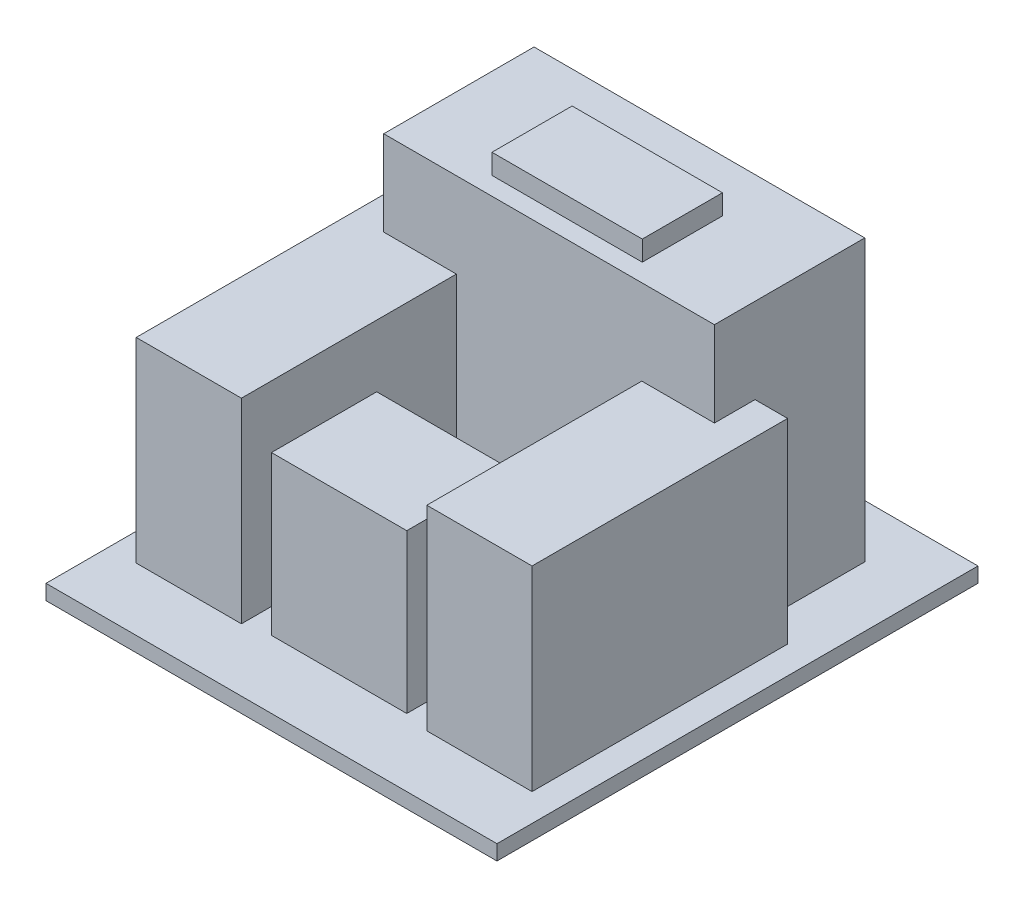
ISO-10303-21;
HEADER;
FILE_DESCRIPTION(('STEP AP214'),'2;1');
FILE_NAME('part.step','',(''),(''),'','','');
FILE_SCHEMA(('AUTOMOTIVE_DESIGN { 1 0 10303 214 1 1 1 1 }'));
ENDSEC;
DATA;
#1=APPLICATION_CONTEXT('core data for automotive mechanical design processes');
#2=APPLICATION_PROTOCOL_DEFINITION('international standard','automotive_design',2000,#1);
#3=PRODUCT_CONTEXT('',#1,'mechanical');
#4=PRODUCT('Part','Part','',(#3));
#5=PRODUCT_RELATED_PRODUCT_CATEGORY('part','',(#4));
#6=PRODUCT_DEFINITION_FORMATION('','',#4);
#7=PRODUCT_DEFINITION_CONTEXT('part definition',#1,'design');
#8=PRODUCT_DEFINITION('design','',#6,#7);
#9=PRODUCT_DEFINITION_SHAPE('','',#8);
#10=(LENGTH_UNIT() NAMED_UNIT(*) SI_UNIT(.MILLI.,.METRE.));
#11=(NAMED_UNIT(*) PLANE_ANGLE_UNIT() SI_UNIT($,.RADIAN.));
#12=(NAMED_UNIT(*) SI_UNIT($,.STERADIAN.) SOLID_ANGLE_UNIT());
#13=UNCERTAINTY_MEASURE_WITH_UNIT(LENGTH_MEASURE(1.E-05),#10,'distance_accuracy_value','');
#14=(GEOMETRIC_REPRESENTATION_CONTEXT(3) GLOBAL_UNCERTAINTY_ASSIGNED_CONTEXT((#13)) GLOBAL_UNIT_ASSIGNED_CONTEXT((#10,
#11,#12)) REPRESENTATION_CONTEXT('',''));
#15=CARTESIAN_POINT('',(0.,0.,0.));
#16=DIRECTION('',(0.,0.,1.));
#17=DIRECTION('',(1.,0.,0.));
#18=AXIS2_PLACEMENT_3D('',#15,#16,#17);
#19=CARTESIAN_POINT('',(0.,280.,0.));
#20=DIRECTION('',(0.,-1.,0.));
#21=DIRECTION('',(0.,0.,-1.));
#22=AXIS2_PLACEMENT_3D('',#19,#20,#21);
#23=PLANE('',#22);
#24=DIRECTION('',(0.,0.,-1.));
#25=VECTOR('',#24,1.);
#26=CARTESIAN_POINT('',(165.,280.,-37.));
#27=LINE('',#26,#25);
#28=CARTESIAN_POINT('',(165.,280.,-37.));
#29=VERTEX_POINT('',#28);
#30=CARTESIAN_POINT('',(165.,280.,-187.));
#31=VERTEX_POINT('',#30);
#32=EDGE_CURVE('E337',#29,#31,#27,.T.);
#33=ORIENTED_EDGE('',*,*,#32,.T.);
#34=DIRECTION('',(-1.,0.,0.));
#35=VECTOR('',#34,1.);
#36=CARTESIAN_POINT('',(-165.,280.,-187.));
#37=LINE('',#36,#35);
#38=CARTESIAN_POINT('',(-165.,280.,-187.));
#39=VERTEX_POINT('',#38);
#40=EDGE_CURVE('E340',#31,#39,#37,.T.);
#41=ORIENTED_EDGE('',*,*,#40,.T.);
#42=DIRECTION('',(0.,0.,1.));
#43=VECTOR('',#42,1.);
#44=CARTESIAN_POINT('',(-165.,280.,-37.));
#45=LINE('',#44,#43);
#46=CARTESIAN_POINT('',(-165.,280.,-37.));
#47=VERTEX_POINT('',#46);
#48=EDGE_CURVE('E343',#39,#47,#45,.T.);
#49=ORIENTED_EDGE('',*,*,#48,.T.);
#50=DIRECTION('',(1.,0.,0.));
#51=VECTOR('',#50,1.);
#52=CARTESIAN_POINT('',(-165.,280.,-37.));
#53=LINE('',#52,#51);
#54=EDGE_CURVE('E345',#47,#29,#53,.T.);
#55=ORIENTED_EDGE('',*,*,#54,.T.);
#56=EDGE_LOOP('',(#33,#41,#49,#55));
#57=FACE_BOUND('',#56,.T.);
#58=DIRECTION('',(0.,0.,-1.));
#59=VECTOR('',#58,1.);
#60=CARTESIAN_POINT('',(75.,280.,0.));
#61=LINE('',#60,#59);
#62=CARTESIAN_POINT('',(75.,280.,-55.));
#63=VERTEX_POINT('',#62);
#64=CARTESIAN_POINT('',(75.,280.,-135.));
#65=VERTEX_POINT('',#64);
#66=EDGE_CURVE('E11',#63,#65,#61,.T.);
#67=ORIENTED_EDGE('',*,*,#66,.F.);
#68=DIRECTION('',(1.,0.,0.));
#69=VECTOR('',#68,1.);
#70=CARTESIAN_POINT('',(0.,280.,-55.));
#71=LINE('',#70,#69);
#72=CARTESIAN_POINT('',(-75.,280.,-55.));
#73=VERTEX_POINT('',#72);
#74=EDGE_CURVE('E416',#73,#63,#71,.T.);
#75=ORIENTED_EDGE('',*,*,#74,.F.);
#76=DIRECTION('',(0.,0.,1.));
#77=VECTOR('',#76,1.);
#78=CARTESIAN_POINT('',(-75.,280.,0.));
#79=LINE('',#78,#77);
#80=CARTESIAN_POINT('',(-75.,280.,-135.));
#81=VERTEX_POINT('',#80);
#82=EDGE_CURVE('E59',#81,#73,#79,.T.);
#83=ORIENTED_EDGE('',*,*,#82,.F.);
#84=DIRECTION('',(-1.,0.,0.));
#85=VECTOR('',#84,1.);
#86=CARTESIAN_POINT('',(0.,280.,-135.));
#87=LINE('',#86,#85);
#88=EDGE_CURVE('E49',#65,#81,#87,.T.);
#89=ORIENTED_EDGE('',*,*,#88,.F.);
#90=EDGE_LOOP('',(#67,#75,#83,#89));
#91=FACE_BOUND('',#90,.T.);
#92=ADVANCED_FACE('F41',(#57,#91),#23,.F.);
#93=CARTESIAN_POINT('',(0.,0.,0.));
#94=DIRECTION('',(0.,-1.,0.));
#95=DIRECTION('',(0.,0.,-1.));
#96=AXIS2_PLACEMENT_3D('',#93,#94,#95);
#97=PLANE('',#96);
#98=DIRECTION('',(-1.,0.,0.));
#99=VECTOR('',#98,1.);
#100=CARTESIAN_POINT('',(92.5,0.,-77.5));
#101=LINE('',#100,#99);
#102=CARTESIAN_POINT('',(197.5,0.,-77.5));
#103=VERTEX_POINT('',#102);
#104=CARTESIAN_POINT('',(165.,0.,-77.5));
#105=VERTEX_POINT('',#104);
#106=EDGE_CURVE('E284',#103,#105,#101,.T.);
#107=ORIENTED_EDGE('',*,*,#106,.F.);
#108=DIRECTION('',(0.,0.,-1.));
#109=VECTOR('',#108,1.);
#110=CARTESIAN_POINT('',(197.5,0.,177.5));
#111=LINE('',#110,#109);
#112=CARTESIAN_POINT('',(197.5,0.,177.5));
#113=VERTEX_POINT('',#112);
#114=EDGE_CURVE('E269',#113,#103,#111,.T.);
#115=ORIENTED_EDGE('',*,*,#114,.F.);
#116=DIRECTION('',(1.,0.,0.));
#117=VECTOR('',#116,1.);
#118=CARTESIAN_POINT('',(92.5,0.,177.5));
#119=LINE('',#118,#117);
#120=CARTESIAN_POINT('',(92.5,0.,177.5));
#121=VERTEX_POINT('',#120);
#122=EDGE_CURVE('E274',#121,#113,#119,.T.);
#123=ORIENTED_EDGE('',*,*,#122,.F.);
#124=DIRECTION('',(0.,0.,1.));
#125=VECTOR('',#124,1.);
#126=CARTESIAN_POINT('',(92.5,0.,177.5));
#127=LINE('',#126,#125);
#128=CARTESIAN_POINT('',(92.5,0.,-37.));
#129=VERTEX_POINT('',#128);
#130=EDGE_CURVE('E287',#129,#121,#127,.T.);
#131=ORIENTED_EDGE('',*,*,#130,.F.);
#132=DIRECTION('',(1.,0.,0.));
#133=VECTOR('',#132,1.);
#134=CARTESIAN_POINT('',(-165.,0.,-37.));
#135=LINE('',#134,#133);
#136=CARTESIAN_POINT('',(-92.5,0.,-37.));
#137=VERTEX_POINT('',#136);
#138=EDGE_CURVE('E341',#137,#129,#135,.T.);
#139=ORIENTED_EDGE('',*,*,#138,.F.);
#140=DIRECTION('',(0.,0.,-1.));
#141=VECTOR('',#140,1.);
#142=CARTESIAN_POINT('',(-92.5,0.,177.5));
#143=LINE('',#142,#141);
#144=CARTESIAN_POINT('',(-92.5,0.,177.5));
#145=VERTEX_POINT('',#144);
#146=EDGE_CURVE('E303',#145,#137,#143,.T.);
#147=ORIENTED_EDGE('',*,*,#146,.F.);
#148=DIRECTION('',(1.,0.,0.));
#149=VECTOR('',#148,1.);
#150=CARTESIAN_POINT('',(-197.5,0.,177.5));
#151=LINE('',#150,#149);
#152=CARTESIAN_POINT('',(-197.5,0.,177.5));
#153=VERTEX_POINT('',#152);
#154=EDGE_CURVE('E308',#153,#145,#151,.T.);
#155=ORIENTED_EDGE('',*,*,#154,.F.);
#156=DIRECTION('',(0.,0.,1.));
#157=VECTOR('',#156,1.);
#158=CARTESIAN_POINT('',(-197.5,0.,177.5));
#159=LINE('',#158,#157);
#160=CARTESIAN_POINT('',(-197.5,0.,-77.5));
#161=VERTEX_POINT('',#160);
#162=EDGE_CURVE('E320',#161,#153,#159,.T.);
#163=ORIENTED_EDGE('',*,*,#162,.F.);
#164=DIRECTION('',(-1.,0.,0.));
#165=VECTOR('',#164,1.);
#166=CARTESIAN_POINT('',(-197.5,0.,-77.5));
#167=LINE('',#166,#165);
#168=CARTESIAN_POINT('',(-165.,0.,-77.5));
#169=VERTEX_POINT('',#168);
#170=EDGE_CURVE('E317',#169,#161,#167,.T.);
#171=ORIENTED_EDGE('',*,*,#170,.F.);
#172=DIRECTION('',(0.,0.,1.));
#173=VECTOR('',#172,1.);
#174=CARTESIAN_POINT('',(-165.,0.,-37.));
#175=LINE('',#174,#173);
#176=CARTESIAN_POINT('',(-165.,0.,-187.));
#177=VERTEX_POINT('',#176);
#178=EDGE_CURVE('E352',#177,#169,#175,.T.);
#179=ORIENTED_EDGE('',*,*,#178,.F.);
#180=DIRECTION('',(-1.,0.,0.));
#181=VECTOR('',#180,1.);
#182=CARTESIAN_POINT('',(-165.,0.,-187.));
#183=LINE('',#182,#181);
#184=CARTESIAN_POINT('',(165.,0.,-187.));
#185=VERTEX_POINT('',#184);
#186=EDGE_CURVE('E349',#185,#177,#183,.T.);
#187=ORIENTED_EDGE('',*,*,#186,.F.);
#188=DIRECTION('',(0.,0.,-1.));
#189=VECTOR('',#188,1.);
#190=CARTESIAN_POINT('',(165.,0.,-37.));
#191=LINE('',#190,#189);
#192=EDGE_CURVE('E336',#105,#185,#191,.T.);
#193=ORIENTED_EDGE('',*,*,#192,.F.);
#194=EDGE_LOOP('',(#107,#115,#123,#131,#139,#147,#155,#163,#171,#179,#187,#193));
#195=FACE_BOUND('',#194,.T.);
#196=DIRECTION('',(0.,0.,-1.));
#197=VECTOR('',#196,1.);
#198=CARTESIAN_POINT('',(225.,0.,240.));
#199=LINE('',#198,#197);
#200=CARTESIAN_POINT('',(225.,0.,240.));
#201=VERTEX_POINT('',#200);
#202=CARTESIAN_POINT('',(225.,0.,-240.));
#203=VERTEX_POINT('',#202);
#204=EDGE_CURVE('E366',#201,#203,#199,.T.);
#205=ORIENTED_EDGE('',*,*,#204,.T.);
#206=DIRECTION('',(-1.,0.,0.));
#207=VECTOR('',#206,1.);
#208=CARTESIAN_POINT('',(-225.,0.,-240.));
#209=LINE('',#208,#207);
#210=CARTESIAN_POINT('',(-225.,0.,-240.));
#211=VERTEX_POINT('',#210);
#212=EDGE_CURVE('E383',#203,#211,#209,.T.);
#213=ORIENTED_EDGE('',*,*,#212,.T.);
#214=DIRECTION('',(0.,0.,1.));
#215=VECTOR('',#214,1.);
#216=CARTESIAN_POINT('',(-225.,0.,240.));
#217=LINE('',#216,#215);
#218=CARTESIAN_POINT('',(-225.,0.,240.));
#219=VERTEX_POINT('',#218);
#220=EDGE_CURVE('E386',#211,#219,#217,.T.);
#221=ORIENTED_EDGE('',*,*,#220,.T.);
#222=DIRECTION('',(1.,0.,0.));
#223=VECTOR('',#222,1.);
#224=CARTESIAN_POINT('',(-225.,0.,240.));
#225=LINE('',#224,#223);
#226=EDGE_CURVE('E371',#219,#201,#225,.T.);
#227=ORIENTED_EDGE('',*,*,#226,.T.);
#228=EDGE_LOOP('',(#205,#213,#221,#227));
#229=FACE_BOUND('',#228,.T.);
#230=DIRECTION('',(0.,0.,-1.));
#231=VECTOR('',#230,1.);
#232=CARTESIAN_POINT('',(67.5,0.,172.5));
#233=LINE('',#232,#231);
#234=CARTESIAN_POINT('',(67.5,0.,172.5));
#235=VERTEX_POINT('',#234);
#236=CARTESIAN_POINT('',(67.5,0.,67.5));
#237=VERTEX_POINT('',#236);
#238=EDGE_CURVE('E231',#235,#237,#233,.T.);
#239=ORIENTED_EDGE('',*,*,#238,.F.);
#240=DIRECTION('',(1.,0.,0.));
#241=VECTOR('',#240,1.);
#242=CARTESIAN_POINT('',(-67.5,0.,172.5));
#243=LINE('',#242,#241);
#244=CARTESIAN_POINT('',(-67.5,0.,172.5));
#245=VERTEX_POINT('',#244);
#246=EDGE_CURVE('E244',#245,#235,#243,.T.);
#247=ORIENTED_EDGE('',*,*,#246,.F.);
#248=DIRECTION('',(0.,0.,1.));
#249=VECTOR('',#248,1.);
#250=CARTESIAN_POINT('',(-67.5,0.,172.5));
#251=LINE('',#250,#249);
#252=CARTESIAN_POINT('',(-67.5,0.,67.5));
#253=VERTEX_POINT('',#252);
#254=EDGE_CURVE('E253',#253,#245,#251,.T.);
#255=ORIENTED_EDGE('',*,*,#254,.F.);
#256=DIRECTION('',(-1.,0.,0.));
#257=VECTOR('',#256,1.);
#258=CARTESIAN_POINT('',(-67.5,0.,67.5));
#259=LINE('',#258,#257);
#260=EDGE_CURVE('E234',#237,#253,#259,.T.);
#261=ORIENTED_EDGE('',*,*,#260,.F.);
#262=EDGE_LOOP('',(#239,#247,#255,#261));
#263=FACE_BOUND('',#262,.T.);
#264=ADVANCED_FACE('F430',(#195,#229,#263),#97,.F.);
#265=CARTESIAN_POINT('',(-165.,280.,-37.));
#266=DIRECTION('',(0.,0.,-1.));
#267=DIRECTION('',(-1.,0.,0.));
#268=AXIS2_PLACEMENT_3D('',#265,#266,#267);
#269=PLANE('',#268);
#270=DIRECTION('',(0.,-1.,0.));
#271=VECTOR('',#270,1.);
#272=CARTESIAN_POINT('',(92.5,280.,-37.));
#273=LINE('',#272,#271);
#274=CARTESIAN_POINT('',(92.5,195.,-37.));
#275=VERTEX_POINT('',#274);
#276=EDGE_CURVE('E413',#275,#129,#273,.T.);
#277=ORIENTED_EDGE('',*,*,#276,.F.);
#278=DIRECTION('',(-1.,0.,0.));
#279=VECTOR('',#278,1.);
#280=CARTESIAN_POINT('',(-165.,195.,-37.));
#281=LINE('',#280,#279);
#282=CARTESIAN_POINT('',(165.,195.,-37.));
#283=VERTEX_POINT('',#282);
#284=EDGE_CURVE('E300',#283,#275,#281,.T.);
#285=ORIENTED_EDGE('',*,*,#284,.F.);
#286=DIRECTION('',(0.,-1.,0.));
#287=VECTOR('',#286,1.);
#288=CARTESIAN_POINT('',(165.,280.,-37.));
#289=LINE('',#288,#287);
#290=EDGE_CURVE('E347',#29,#283,#289,.T.);
#291=ORIENTED_EDGE('',*,*,#290,.F.);
#292=ORIENTED_EDGE('',*,*,#54,.F.);
#293=DIRECTION('',(0.,-1.,0.));
#294=VECTOR('',#293,1.);
#295=CARTESIAN_POINT('',(-165.,280.,-37.));
#296=LINE('',#295,#294);
#297=CARTESIAN_POINT('',(-165.,195.,-37.));
#298=VERTEX_POINT('',#297);
#299=EDGE_CURVE('E358',#47,#298,#296,.T.);
#300=ORIENTED_EDGE('',*,*,#299,.T.);
#301=DIRECTION('',(-1.,0.,0.));
#302=VECTOR('',#301,1.);
#303=CARTESIAN_POINT('',(-165.,195.,-37.));
#304=LINE('',#303,#302);
#305=CARTESIAN_POINT('',(-92.5,195.,-37.));
#306=VERTEX_POINT('',#305);
#307=EDGE_CURVE('E393',#306,#298,#304,.T.);
#308=ORIENTED_EDGE('',*,*,#307,.F.);
#309=DIRECTION('',(0.,1.,0.));
#310=VECTOR('',#309,1.);
#311=CARTESIAN_POINT('',(-92.5,280.,-37.));
#312=LINE('',#311,#310);
#313=EDGE_CURVE('E401',#137,#306,#312,.T.);
#314=ORIENTED_EDGE('',*,*,#313,.F.);
#315=ORIENTED_EDGE('',*,*,#138,.T.);
#316=EDGE_LOOP('',(#277,#285,#291,#292,#300,#308,#314,#315));
#317=FACE_BOUND('',#316,.T.);
#318=ADVANCED_FACE('F438',(#317),#269,.F.);
#319=CARTESIAN_POINT('',(165.,280.,-37.));
#320=DIRECTION('',(-1.,0.,0.));
#321=DIRECTION('',(0.,0.,1.));
#322=AXIS2_PLACEMENT_3D('',#319,#320,#321);
#323=PLANE('',#322);
#324=DIRECTION('',(0.,1.,0.));
#325=VECTOR('',#324,1.);
#326=CARTESIAN_POINT('',(165.,280.,-77.5));
#327=LINE('',#326,#325);
#328=CARTESIAN_POINT('',(165.,195.,-77.5));
#329=VERTEX_POINT('',#328);
#330=EDGE_CURVE('E410',#105,#329,#327,.T.);
#331=ORIENTED_EDGE('',*,*,#330,.F.);
#332=ORIENTED_EDGE('',*,*,#192,.T.);
#333=DIRECTION('',(0.,-1.,0.));
#334=VECTOR('',#333,1.);
#335=CARTESIAN_POINT('',(165.,280.,-187.));
#336=LINE('',#335,#334);
#337=EDGE_CURVE('E363',#31,#185,#336,.T.);
#338=ORIENTED_EDGE('',*,*,#337,.F.);
#339=ORIENTED_EDGE('',*,*,#32,.F.);
#340=ORIENTED_EDGE('',*,*,#290,.T.);
#341=DIRECTION('',(0.,0.,1.));
#342=VECTOR('',#341,1.);
#343=CARTESIAN_POINT('',(165.,195.,-37.));
#344=LINE('',#343,#342);
#345=EDGE_CURVE('E407',#329,#283,#344,.T.);
#346=ORIENTED_EDGE('',*,*,#345,.F.);
#347=EDGE_LOOP('',(#331,#332,#338,#339,#340,#346));
#348=FACE_BOUND('',#347,.T.);
#349=ADVANCED_FACE('F447',(#348),#323,.F.);
#350=CARTESIAN_POINT('',(-165.,280.,-37.));
#351=DIRECTION('',(1.,0.,0.));
#352=DIRECTION('',(0.,0.,-1.));
#353=AXIS2_PLACEMENT_3D('',#350,#351,#352);
#354=PLANE('',#353);
#355=DIRECTION('',(0.,-1.,0.));
#356=VECTOR('',#355,1.);
#357=CARTESIAN_POINT('',(-165.,280.,-77.5));
#358=LINE('',#357,#356);
#359=CARTESIAN_POINT('',(-165.,195.,-77.5));
#360=VERTEX_POINT('',#359);
#361=EDGE_CURVE('E404',#360,#169,#358,.T.);
#362=ORIENTED_EDGE('',*,*,#361,.F.);
#363=DIRECTION('',(0.,0.,-1.));
#364=VECTOR('',#363,1.);
#365=CARTESIAN_POINT('',(-165.,195.,-37.));
#366=LINE('',#365,#364);
#367=EDGE_CURVE('E333',#298,#360,#366,.T.);
#368=ORIENTED_EDGE('',*,*,#367,.F.);
#369=ORIENTED_EDGE('',*,*,#299,.F.);
#370=ORIENTED_EDGE('',*,*,#48,.F.);
#371=DIRECTION('',(0.,-1.,0.));
#372=VECTOR('',#371,1.);
#373=CARTESIAN_POINT('',(-165.,280.,-187.));
#374=LINE('',#373,#372);
#375=EDGE_CURVE('E360',#39,#177,#374,.T.);
#376=ORIENTED_EDGE('',*,*,#375,.T.);
#377=ORIENTED_EDGE('',*,*,#178,.T.);
#378=EDGE_LOOP('',(#362,#368,#369,#370,#376,#377));
#379=FACE_BOUND('',#378,.T.);
#380=ADVANCED_FACE('F449',(#379),#354,.F.);
#381=CARTESIAN_POINT('',(225.,-15.,240.));
#382=DIRECTION('',(1.,0.,0.));
#383=DIRECTION('',(0.,0.,-1.));
#384=AXIS2_PLACEMENT_3D('',#381,#382,#383);
#385=PLANE('',#384);
#386=ORIENTED_EDGE('',*,*,#204,.F.);
#387=DIRECTION('',(0.,1.,0.));
#388=VECTOR('',#387,1.);
#389=CARTESIAN_POINT('',(225.,-15.,240.));
#390=LINE('',#389,#388);
#391=CARTESIAN_POINT('',(225.,-15.,240.));
#392=VERTEX_POINT('',#391);
#393=EDGE_CURVE('E391',#392,#201,#390,.T.);
#394=ORIENTED_EDGE('',*,*,#393,.F.);
#395=DIRECTION('',(0.,0.,-1.));
#396=VECTOR('',#395,1.);
#397=CARTESIAN_POINT('',(225.,-15.,240.));
#398=LINE('',#397,#396);
#399=CARTESIAN_POINT('',(225.,-15.,-240.));
#400=VERTEX_POINT('',#399);
#401=EDGE_CURVE('E367',#392,#400,#398,.T.);
#402=ORIENTED_EDGE('',*,*,#401,.T.);
#403=DIRECTION('',(0.,1.,0.));
#404=VECTOR('',#403,1.);
#405=CARTESIAN_POINT('',(225.,-15.,-240.));
#406=LINE('',#405,#404);
#407=EDGE_CURVE('E380',#400,#203,#406,.T.);
#408=ORIENTED_EDGE('',*,*,#407,.T.);
#409=EDGE_LOOP('',(#386,#394,#402,#408));
#410=FACE_BOUND('',#409,.T.);
#411=ADVANCED_FACE('F43',(#410),#385,.T.);
#412=CARTESIAN_POINT('',(-225.,-15.,240.));
#413=DIRECTION('',(0.,0.,1.));
#414=DIRECTION('',(1.,0.,0.));
#415=AXIS2_PLACEMENT_3D('',#412,#413,#414);
#416=PLANE('',#415);
#417=ORIENTED_EDGE('',*,*,#226,.F.);
#418=DIRECTION('',(0.,1.,0.));
#419=VECTOR('',#418,1.);
#420=CARTESIAN_POINT('',(-225.,-15.,240.));
#421=LINE('',#420,#419);
#422=CARTESIAN_POINT('',(-225.,-15.,240.));
#423=VERTEX_POINT('',#422);
#424=EDGE_CURVE('E394',#423,#219,#421,.T.);
#425=ORIENTED_EDGE('',*,*,#424,.F.);
#426=DIRECTION('',(1.,0.,0.));
#427=VECTOR('',#426,1.);
#428=CARTESIAN_POINT('',(-225.,-15.,240.));
#429=LINE('',#428,#427);
#430=EDGE_CURVE('E377',#423,#392,#429,.T.);
#431=ORIENTED_EDGE('',*,*,#430,.T.);
#432=ORIENTED_EDGE('',*,*,#393,.T.);
#433=EDGE_LOOP('',(#417,#425,#431,#432));
#434=FACE_BOUND('',#433,.T.);
#435=ADVANCED_FACE('F466',(#434),#416,.T.);
#436=CARTESIAN_POINT('',(-225.,-15.,240.));
#437=DIRECTION('',(-1.,0.,0.));
#438=DIRECTION('',(0.,0.,1.));
#439=AXIS2_PLACEMENT_3D('',#436,#437,#438);
#440=PLANE('',#439);
#441=ORIENTED_EDGE('',*,*,#220,.F.);
#442=DIRECTION('',(0.,1.,0.));
#443=VECTOR('',#442,1.);
#444=CARTESIAN_POINT('',(-225.,-15.,-240.));
#445=LINE('',#444,#443);
#446=CARTESIAN_POINT('',(-225.,-15.,-240.));
#447=VERTEX_POINT('',#446);
#448=EDGE_CURVE('E396',#447,#211,#445,.T.);
#449=ORIENTED_EDGE('',*,*,#448,.F.);
#450=DIRECTION('',(0.,0.,1.));
#451=VECTOR('',#450,1.);
#452=CARTESIAN_POINT('',(-225.,-15.,240.));
#453=LINE('',#452,#451);
#454=EDGE_CURVE('E374',#447,#423,#453,.T.);
#455=ORIENTED_EDGE('',*,*,#454,.T.);
#456=ORIENTED_EDGE('',*,*,#424,.T.);
#457=EDGE_LOOP('',(#441,#449,#455,#456));
#458=FACE_BOUND('',#457,.T.);
#459=ADVANCED_FACE('F469',(#458),#440,.T.);
#460=CARTESIAN_POINT('',(-225.,-15.,-240.));
#461=DIRECTION('',(0.,0.,-1.));
#462=DIRECTION('',(-1.,0.,0.));
#463=AXIS2_PLACEMENT_3D('',#460,#461,#462);
#464=PLANE('',#463);
#465=ORIENTED_EDGE('',*,*,#212,.F.);
#466=ORIENTED_EDGE('',*,*,#407,.F.);
#467=DIRECTION('',(-1.,0.,0.));
#468=VECTOR('',#467,1.);
#469=CARTESIAN_POINT('',(-225.,-15.,-240.));
#470=LINE('',#469,#468);
#471=EDGE_CURVE('E370',#400,#447,#470,.T.);
#472=ORIENTED_EDGE('',*,*,#471,.T.);
#473=ORIENTED_EDGE('',*,*,#448,.T.);
#474=EDGE_LOOP('',(#465,#466,#472,#473));
#475=FACE_BOUND('',#474,.T.);
#476=ADVANCED_FACE('F463',(#475),#464,.T.);
#477=CARTESIAN_POINT('',(0.,-15.,0.));
#478=DIRECTION('',(0.,-1.,0.));
#479=DIRECTION('',(0.,0.,-1.));
#480=AXIS2_PLACEMENT_3D('',#477,#478,#479);
#481=PLANE('',#480);
#482=ORIENTED_EDGE('',*,*,#401,.F.);
#483=ORIENTED_EDGE('',*,*,#430,.F.);
#484=ORIENTED_EDGE('',*,*,#454,.F.);
#485=ORIENTED_EDGE('',*,*,#471,.F.);
#486=EDGE_LOOP('',(#482,#483,#484,#485));
#487=FACE_BOUND('',#486,.T.);
#488=ADVANCED_FACE('F457',(#487),#481,.T.);
#489=CARTESIAN_POINT('',(-165.,280.,-187.));
#490=DIRECTION('',(0.,0.,1.));
#491=DIRECTION('',(1.,0.,0.));
#492=AXIS2_PLACEMENT_3D('',#489,#490,#491);
#493=PLANE('',#492);
#494=ORIENTED_EDGE('',*,*,#186,.T.);
#495=ORIENTED_EDGE('',*,*,#375,.F.);
#496=ORIENTED_EDGE('',*,*,#40,.F.);
#497=ORIENTED_EDGE('',*,*,#337,.T.);
#498=EDGE_LOOP('',(#494,#495,#496,#497));
#499=FACE_BOUND('',#498,.T.);
#500=ADVANCED_FACE('F453',(#499),#493,.F.);
#501=CARTESIAN_POINT('',(-197.5,195.,-77.5));
#502=DIRECTION('',(0.,0.,1.));
#503=DIRECTION('',(1.,0.,0.));
#504=AXIS2_PLACEMENT_3D('',#501,#502,#503);
#505=PLANE('',#504);
#506=DIRECTION('',(-1.,0.,0.));
#507=VECTOR('',#506,1.);
#508=CARTESIAN_POINT('',(-197.5,195.,-77.5));
#509=LINE('',#508,#507);
#510=CARTESIAN_POINT('',(-197.5,195.,-77.5));
#511=VERTEX_POINT('',#510);
#512=EDGE_CURVE('E307',#360,#511,#509,.T.);
#513=ORIENTED_EDGE('',*,*,#512,.F.);
#514=ORIENTED_EDGE('',*,*,#361,.T.);
#515=ORIENTED_EDGE('',*,*,#170,.T.);
#516=DIRECTION('',(0.,-1.,0.));
#517=VECTOR('',#516,1.);
#518=CARTESIAN_POINT('',(-197.5,195.,-77.5));
#519=LINE('',#518,#517);
#520=EDGE_CURVE('E330',#511,#161,#519,.T.);
#521=ORIENTED_EDGE('',*,*,#520,.F.);
#522=EDGE_LOOP('',(#513,#514,#515,#521));
#523=FACE_BOUND('',#522,.T.);
#524=ADVANCED_FACE('F456',(#523),#505,.F.);
#525=CARTESIAN_POINT('',(-92.5,195.,177.5));
#526=DIRECTION('',(-1.,0.,0.));
#527=DIRECTION('',(0.,0.,1.));
#528=AXIS2_PLACEMENT_3D('',#525,#526,#527);
#529=PLANE('',#528);
#530=ORIENTED_EDGE('',*,*,#146,.T.);
#531=ORIENTED_EDGE('',*,*,#313,.T.);
#532=DIRECTION('',(0.,0.,-1.));
#533=VECTOR('',#532,1.);
#534=CARTESIAN_POINT('',(-92.5,195.,177.5));
#535=LINE('',#534,#533);
#536=CARTESIAN_POINT('',(-92.5,195.,177.5));
#537=VERTEX_POINT('',#536);
#538=EDGE_CURVE('E304',#537,#306,#535,.T.);
#539=ORIENTED_EDGE('',*,*,#538,.F.);
#540=DIRECTION('',(0.,-1.,0.));
#541=VECTOR('',#540,1.);
#542=CARTESIAN_POINT('',(-92.5,195.,177.5));
#543=LINE('',#542,#541);
#544=EDGE_CURVE('E314',#537,#145,#543,.T.);
#545=ORIENTED_EDGE('',*,*,#544,.T.);
#546=EDGE_LOOP('',(#530,#531,#539,#545));
#547=FACE_BOUND('',#546,.T.);
#548=ADVANCED_FACE('F443',(#547),#529,.F.);
#549=CARTESIAN_POINT('',(0.,195.,0.));
#550=DIRECTION('',(0.,-1.,0.));
#551=DIRECTION('',(0.,0.,-1.));
#552=AXIS2_PLACEMENT_3D('',#549,#550,#551);
#553=PLANE('',#552);
#554=ORIENTED_EDGE('',*,*,#307,.T.);
#555=ORIENTED_EDGE('',*,*,#367,.T.);
#556=ORIENTED_EDGE('',*,*,#512,.T.);
#557=DIRECTION('',(0.,0.,1.));
#558=VECTOR('',#557,1.);
#559=CARTESIAN_POINT('',(-197.5,195.,177.5));
#560=LINE('',#559,#558);
#561=CARTESIAN_POINT('',(-197.5,195.,177.5));
#562=VERTEX_POINT('',#561);
#563=EDGE_CURVE('E310',#511,#562,#560,.T.);
#564=ORIENTED_EDGE('',*,*,#563,.T.);
#565=DIRECTION('',(1.,0.,0.));
#566=VECTOR('',#565,1.);
#567=CARTESIAN_POINT('',(-197.5,195.,177.5));
#568=LINE('',#567,#566);
#569=EDGE_CURVE('E312',#562,#537,#568,.T.);
#570=ORIENTED_EDGE('',*,*,#569,.T.);
#571=ORIENTED_EDGE('',*,*,#538,.T.);
#572=EDGE_LOOP('',(#554,#555,#556,#564,#570,#571));
#573=FACE_BOUND('',#572,.T.);
#574=ADVANCED_FACE('F540',(#573),#553,.F.);
#575=CARTESIAN_POINT('',(-197.5,195.,177.5));
#576=DIRECTION('',(1.,0.,0.));
#577=DIRECTION('',(0.,0.,-1.));
#578=AXIS2_PLACEMENT_3D('',#575,#576,#577);
#579=PLANE('',#578);
#580=ORIENTED_EDGE('',*,*,#162,.T.);
#581=DIRECTION('',(0.,-1.,0.));
#582=VECTOR('',#581,1.);
#583=CARTESIAN_POINT('',(-197.5,195.,177.5));
#584=LINE('',#583,#582);
#585=EDGE_CURVE('E327',#562,#153,#584,.T.);
#586=ORIENTED_EDGE('',*,*,#585,.F.);
#587=ORIENTED_EDGE('',*,*,#563,.F.);
#588=ORIENTED_EDGE('',*,*,#520,.T.);
#589=EDGE_LOOP('',(#580,#586,#587,#588));
#590=FACE_BOUND('',#589,.T.);
#591=ADVANCED_FACE('F549',(#590),#579,.F.);
#592=CARTESIAN_POINT('',(-197.5,195.,177.5));
#593=DIRECTION('',(0.,0.,-1.));
#594=DIRECTION('',(-1.,0.,0.));
#595=AXIS2_PLACEMENT_3D('',#592,#593,#594);
#596=PLANE('',#595);
#597=ORIENTED_EDGE('',*,*,#154,.T.);
#598=ORIENTED_EDGE('',*,*,#544,.F.);
#599=ORIENTED_EDGE('',*,*,#569,.F.);
#600=ORIENTED_EDGE('',*,*,#585,.T.);
#601=EDGE_LOOP('',(#597,#598,#599,#600));
#602=FACE_BOUND('',#601,.T.);
#603=ADVANCED_FACE('F559',(#602),#596,.F.);
#604=CARTESIAN_POINT('',(92.5,195.,177.5));
#605=DIRECTION('',(1.,0.,0.));
#606=DIRECTION('',(0.,0.,-1.));
#607=AXIS2_PLACEMENT_3D('',#604,#605,#606);
#608=PLANE('',#607);
#609=DIRECTION('',(0.,0.,1.));
#610=VECTOR('',#609,1.);
#611=CARTESIAN_POINT('',(92.5,195.,177.5));
#612=LINE('',#611,#610);
#613=CARTESIAN_POINT('',(92.5,195.,177.5));
#614=VERTEX_POINT('',#613);
#615=EDGE_CURVE('E277',#275,#614,#612,.T.);
#616=ORIENTED_EDGE('',*,*,#615,.F.);
#617=ORIENTED_EDGE('',*,*,#276,.T.);
#618=ORIENTED_EDGE('',*,*,#130,.T.);
#619=DIRECTION('',(0.,-1.,0.));
#620=VECTOR('',#619,1.);
#621=CARTESIAN_POINT('',(92.5,195.,177.5));
#622=LINE('',#621,#620);
#623=EDGE_CURVE('E294',#614,#121,#622,.T.);
#624=ORIENTED_EDGE('',*,*,#623,.F.);
#625=EDGE_LOOP('',(#616,#617,#618,#624));
#626=FACE_BOUND('',#625,.T.);
#627=ADVANCED_FACE('F569',(#626),#608,.F.);
#628=CARTESIAN_POINT('',(92.5,195.,-77.5));
#629=DIRECTION('',(0.,0.,1.));
#630=DIRECTION('',(1.,0.,0.));
#631=AXIS2_PLACEMENT_3D('',#628,#629,#630);
#632=PLANE('',#631);
#633=ORIENTED_EDGE('',*,*,#106,.T.);
#634=ORIENTED_EDGE('',*,*,#330,.T.);
#635=DIRECTION('',(-1.,0.,0.));
#636=VECTOR('',#635,1.);
#637=CARTESIAN_POINT('',(92.5,195.,-77.5));
#638=LINE('',#637,#636);
#639=CARTESIAN_POINT('',(197.5,195.,-77.5));
#640=VERTEX_POINT('',#639);
#641=EDGE_CURVE('E273',#640,#329,#638,.T.);
#642=ORIENTED_EDGE('',*,*,#641,.F.);
#643=DIRECTION('',(0.,-1.,0.));
#644=VECTOR('',#643,1.);
#645=CARTESIAN_POINT('',(197.5,195.,-77.5));
#646=LINE('',#645,#644);
#647=EDGE_CURVE('E297',#640,#103,#646,.T.);
#648=ORIENTED_EDGE('',*,*,#647,.T.);
#649=EDGE_LOOP('',(#633,#634,#642,#648));
#650=FACE_BOUND('',#649,.T.);
#651=ADVANCED_FACE('F590',(#650),#632,.F.);
#652=CARTESIAN_POINT('',(0.,195.,0.));
#653=DIRECTION('',(0.,-1.,0.));
#654=DIRECTION('',(0.,0.,-1.));
#655=AXIS2_PLACEMENT_3D('',#652,#653,#654);
#656=PLANE('',#655);
#657=ORIENTED_EDGE('',*,*,#345,.T.);
#658=ORIENTED_EDGE('',*,*,#284,.T.);
#659=ORIENTED_EDGE('',*,*,#615,.T.);
#660=DIRECTION('',(1.,0.,0.));
#661=VECTOR('',#660,1.);
#662=CARTESIAN_POINT('',(92.5,195.,177.5));
#663=LINE('',#662,#661);
#664=CARTESIAN_POINT('',(197.5,195.,177.5));
#665=VERTEX_POINT('',#664);
#666=EDGE_CURVE('E279',#614,#665,#663,.T.);
#667=ORIENTED_EDGE('',*,*,#666,.T.);
#668=DIRECTION('',(0.,0.,-1.));
#669=VECTOR('',#668,1.);
#670=CARTESIAN_POINT('',(197.5,195.,177.5));
#671=LINE('',#670,#669);
#672=EDGE_CURVE('E270',#665,#640,#671,.T.);
#673=ORIENTED_EDGE('',*,*,#672,.T.);
#674=ORIENTED_EDGE('',*,*,#641,.T.);
#675=EDGE_LOOP('',(#657,#658,#659,#667,#673,#674));
#676=FACE_BOUND('',#675,.T.);
#677=ADVANCED_FACE('F600',(#676),#656,.F.);
#678=CARTESIAN_POINT('',(197.5,195.,177.5));
#679=DIRECTION('',(-1.,0.,0.));
#680=DIRECTION('',(0.,0.,1.));
#681=AXIS2_PLACEMENT_3D('',#678,#679,#680);
#682=PLANE('',#681);
#683=ORIENTED_EDGE('',*,*,#114,.T.);
#684=ORIENTED_EDGE('',*,*,#647,.F.);
#685=ORIENTED_EDGE('',*,*,#672,.F.);
#686=DIRECTION('',(0.,-1.,0.));
#687=VECTOR('',#686,1.);
#688=CARTESIAN_POINT('',(197.5,195.,177.5));
#689=LINE('',#688,#687);
#690=EDGE_CURVE('E281',#665,#113,#689,.T.);
#691=ORIENTED_EDGE('',*,*,#690,.T.);
#692=EDGE_LOOP('',(#683,#684,#685,#691));
#693=FACE_BOUND('',#692,.T.);
#694=ADVANCED_FACE('F610',(#693),#682,.F.);
#695=CARTESIAN_POINT('',(92.5,195.,177.5));
#696=DIRECTION('',(0.,0.,-1.));
#697=DIRECTION('',(-1.,0.,0.));
#698=AXIS2_PLACEMENT_3D('',#695,#696,#697);
#699=PLANE('',#698);
#700=ORIENTED_EDGE('',*,*,#122,.T.);
#701=ORIENTED_EDGE('',*,*,#690,.F.);
#702=ORIENTED_EDGE('',*,*,#666,.F.);
#703=ORIENTED_EDGE('',*,*,#623,.T.);
#704=EDGE_LOOP('',(#700,#701,#702,#703));
#705=FACE_BOUND('',#704,.T.);
#706=ADVANCED_FACE('F620',(#705),#699,.F.);
#707=CARTESIAN_POINT('',(67.5,158.,172.5));
#708=DIRECTION('',(-1.,0.,0.));
#709=DIRECTION('',(0.,0.,1.));
#710=AXIS2_PLACEMENT_3D('',#707,#708,#709);
#711=PLANE('',#710);
#712=ORIENTED_EDGE('',*,*,#238,.T.);
#713=DIRECTION('',(0.,-1.,0.));
#714=VECTOR('',#713,1.);
#715=CARTESIAN_POINT('',(67.5,158.,67.5));
#716=LINE('',#715,#714);
#717=CARTESIAN_POINT('',(67.5,158.,67.5));
#718=VERTEX_POINT('',#717);
#719=EDGE_CURVE('E266',#718,#237,#716,.T.);
#720=ORIENTED_EDGE('',*,*,#719,.F.);
#721=DIRECTION('',(0.,0.,-1.));
#722=VECTOR('',#721,1.);
#723=CARTESIAN_POINT('',(67.5,158.,172.5));
#724=LINE('',#723,#722);
#725=CARTESIAN_POINT('',(67.5,158.,172.5));
#726=VERTEX_POINT('',#725);
#727=EDGE_CURVE('E240',#726,#718,#724,.T.);
#728=ORIENTED_EDGE('',*,*,#727,.F.);
#729=DIRECTION('',(0.,-1.,0.));
#730=VECTOR('',#729,1.);
#731=CARTESIAN_POINT('',(67.5,158.,172.5));
#732=LINE('',#731,#730);
#733=EDGE_CURVE('E249',#726,#235,#732,.T.);
#734=ORIENTED_EDGE('',*,*,#733,.T.);
#735=EDGE_LOOP('',(#712,#720,#728,#734));
#736=FACE_BOUND('',#735,.T.);
#737=ADVANCED_FACE('F630',(#736),#711,.F.);
#738=CARTESIAN_POINT('',(-67.5,158.,67.5));
#739=DIRECTION('',(0.,0.,1.));
#740=DIRECTION('',(1.,0.,0.));
#741=AXIS2_PLACEMENT_3D('',#738,#739,#740);
#742=PLANE('',#741);
#743=ORIENTED_EDGE('',*,*,#260,.T.);
#744=DIRECTION('',(0.,-1.,0.));
#745=VECTOR('',#744,1.);
#746=CARTESIAN_POINT('',(-67.5,158.,67.5));
#747=LINE('',#746,#745);
#748=CARTESIAN_POINT('',(-67.5,158.,67.5));
#749=VERTEX_POINT('',#748);
#750=EDGE_CURVE('E263',#749,#253,#747,.T.);
#751=ORIENTED_EDGE('',*,*,#750,.F.);
#752=DIRECTION('',(-1.,0.,0.));
#753=VECTOR('',#752,1.);
#754=CARTESIAN_POINT('',(-67.5,158.,67.5));
#755=LINE('',#754,#753);
#756=EDGE_CURVE('E243',#718,#749,#755,.T.);
#757=ORIENTED_EDGE('',*,*,#756,.F.);
#758=ORIENTED_EDGE('',*,*,#719,.T.);
#759=EDGE_LOOP('',(#743,#751,#757,#758));
#760=FACE_BOUND('',#759,.T.);
#761=ADVANCED_FACE('F646',(#760),#742,.F.);
#762=CARTESIAN_POINT('',(-67.5,158.,172.5));
#763=DIRECTION('',(1.,0.,0.));
#764=DIRECTION('',(0.,0.,-1.));
#765=AXIS2_PLACEMENT_3D('',#762,#763,#764);
#766=PLANE('',#765);
#767=ORIENTED_EDGE('',*,*,#254,.T.);
#768=DIRECTION('',(0.,-1.,0.));
#769=VECTOR('',#768,1.);
#770=CARTESIAN_POINT('',(-67.5,158.,172.5));
#771=LINE('',#770,#769);
#772=CARTESIAN_POINT('',(-67.5,158.,172.5));
#773=VERTEX_POINT('',#772);
#774=EDGE_CURVE('E260',#773,#245,#771,.T.);
#775=ORIENTED_EDGE('',*,*,#774,.F.);
#776=DIRECTION('',(0.,0.,1.));
#777=VECTOR('',#776,1.);
#778=CARTESIAN_POINT('',(-67.5,158.,172.5));
#779=LINE('',#778,#777);
#780=EDGE_CURVE('E246',#749,#773,#779,.T.);
#781=ORIENTED_EDGE('',*,*,#780,.F.);
#782=ORIENTED_EDGE('',*,*,#750,.T.);
#783=EDGE_LOOP('',(#767,#775,#781,#782));
#784=FACE_BOUND('',#783,.T.);
#785=ADVANCED_FACE('F656',(#784),#766,.F.);
#786=CARTESIAN_POINT('',(-67.5,158.,172.5));
#787=DIRECTION('',(0.,0.,-1.));
#788=DIRECTION('',(-1.,0.,0.));
#789=AXIS2_PLACEMENT_3D('',#786,#787,#788);
#790=PLANE('',#789);
#791=ORIENTED_EDGE('',*,*,#246,.T.);
#792=ORIENTED_EDGE('',*,*,#733,.F.);
#793=DIRECTION('',(1.,0.,0.));
#794=VECTOR('',#793,1.);
#795=CARTESIAN_POINT('',(-67.5,158.,172.5));
#796=LINE('',#795,#794);
#797=EDGE_CURVE('E248',#773,#726,#796,.T.);
#798=ORIENTED_EDGE('',*,*,#797,.F.);
#799=ORIENTED_EDGE('',*,*,#774,.T.);
#800=EDGE_LOOP('',(#791,#792,#798,#799));
#801=FACE_BOUND('',#800,.T.);
#802=ADVANCED_FACE('F666',(#801),#790,.F.);
#803=CARTESIAN_POINT('',(0.,158.,0.));
#804=DIRECTION('',(0.,-1.,0.));
#805=DIRECTION('',(0.,0.,-1.));
#806=AXIS2_PLACEMENT_3D('',#803,#804,#805);
#807=PLANE('',#806);
#808=ORIENTED_EDGE('',*,*,#727,.T.);
#809=ORIENTED_EDGE('',*,*,#756,.T.);
#810=ORIENTED_EDGE('',*,*,#780,.T.);
#811=ORIENTED_EDGE('',*,*,#797,.T.);
#812=EDGE_LOOP('',(#808,#809,#810,#811));
#813=FACE_BOUND('',#812,.T.);
#814=ADVANCED_FACE('F676',(#813),#807,.F.);
#815=CARTESIAN_POINT('',(75.,300.,-55.));
#816=DIRECTION('',(-1.,0.,0.));
#817=DIRECTION('',(0.,0.,1.));
#818=AXIS2_PLACEMENT_3D('',#815,#816,#817);
#819=PLANE('',#818);
#820=DIRECTION('',(0.,-1.,0.));
#821=VECTOR('',#820,1.);
#822=CARTESIAN_POINT('',(75.,300.,-55.));
#823=LINE('',#822,#821);
#824=CARTESIAN_POINT('',(75.,300.,-55.));
#825=VERTEX_POINT('',#824);
#826=EDGE_CURVE('E424',#825,#63,#823,.T.);
#827=ORIENTED_EDGE('',*,*,#826,.T.);
#828=ORIENTED_EDGE('',*,*,#66,.T.);
#829=DIRECTION('',(0.,-1.,0.));
#830=VECTOR('',#829,1.);
#831=CARTESIAN_POINT('',(75.,300.,-135.));
#832=LINE('',#831,#830);
#833=CARTESIAN_POINT('',(75.,300.,-135.));
#834=VERTEX_POINT('',#833);
#835=EDGE_CURVE('E214',#834,#65,#832,.T.);
#836=ORIENTED_EDGE('',*,*,#835,.F.);
#837=DIRECTION('',(0.,0.,-1.));
#838=VECTOR('',#837,1.);
#839=CARTESIAN_POINT('',(75.,300.,-55.));
#840=LINE('',#839,#838);
#841=EDGE_CURVE('E220',#825,#834,#840,.T.);
#842=ORIENTED_EDGE('',*,*,#841,.F.);
#843=EDGE_LOOP('',(#827,#828,#836,#842));
#844=FACE_BOUND('',#843,.T.);
#845=ADVANCED_FACE('F230',(#844),#819,.F.);
#846=CARTESIAN_POINT('',(-75.,300.,-135.));
#847=DIRECTION('',(0.,0.,1.));
#848=DIRECTION('',(1.,0.,0.));
#849=AXIS2_PLACEMENT_3D('',#846,#847,#848);
#850=PLANE('',#849);
#851=ORIENTED_EDGE('',*,*,#835,.T.);
#852=ORIENTED_EDGE('',*,*,#88,.T.);
#853=DIRECTION('',(0.,-1.,0.));
#854=VECTOR('',#853,1.);
#855=CARTESIAN_POINT('',(-75.,300.,-135.));
#856=LINE('',#855,#854);
#857=CARTESIAN_POINT('',(-75.,300.,-135.));
#858=VERTEX_POINT('',#857);
#859=EDGE_CURVE('E216',#858,#81,#856,.T.);
#860=ORIENTED_EDGE('',*,*,#859,.F.);
#861=DIRECTION('',(-1.,0.,0.));
#862=VECTOR('',#861,1.);
#863=CARTESIAN_POINT('',(-75.,300.,-135.));
#864=LINE('',#863,#862);
#865=EDGE_CURVE('E210',#834,#858,#864,.T.);
#866=ORIENTED_EDGE('',*,*,#865,.F.);
#867=EDGE_LOOP('',(#851,#852,#860,#866));
#868=FACE_BOUND('',#867,.T.);
#869=ADVANCED_FACE('F212',(#868),#850,.F.);
#870=CARTESIAN_POINT('',(-75.,300.,-55.));
#871=DIRECTION('',(1.,0.,0.));
#872=DIRECTION('',(0.,0.,-1.));
#873=AXIS2_PLACEMENT_3D('',#870,#871,#872);
#874=PLANE('',#873);
#875=ORIENTED_EDGE('',*,*,#859,.T.);
#876=ORIENTED_EDGE('',*,*,#82,.T.);
#877=DIRECTION('',(0.,-1.,0.));
#878=VECTOR('',#877,1.);
#879=CARTESIAN_POINT('',(-75.,300.,-55.));
#880=LINE('',#879,#878);
#881=CARTESIAN_POINT('',(-75.,300.,-55.));
#882=VERTEX_POINT('',#881);
#883=EDGE_CURVE('E236',#882,#73,#880,.T.);
#884=ORIENTED_EDGE('',*,*,#883,.F.);
#885=DIRECTION('',(0.,0.,1.));
#886=VECTOR('',#885,1.);
#887=CARTESIAN_POINT('',(-75.,300.,-55.));
#888=LINE('',#887,#886);
#889=EDGE_CURVE('E219',#858,#882,#888,.T.);
#890=ORIENTED_EDGE('',*,*,#889,.F.);
#891=EDGE_LOOP('',(#875,#876,#884,#890));
#892=FACE_BOUND('',#891,.T.);
#893=ADVANCED_FACE('F420',(#892),#874,.F.);
#894=CARTESIAN_POINT('',(-75.,300.,-55.));
#895=DIRECTION('',(0.,0.,-1.));
#896=DIRECTION('',(-1.,0.,0.));
#897=AXIS2_PLACEMENT_3D('',#894,#895,#896);
#898=PLANE('',#897);
#899=ORIENTED_EDGE('',*,*,#883,.T.);
#900=ORIENTED_EDGE('',*,*,#74,.T.);
#901=ORIENTED_EDGE('',*,*,#826,.F.);
#902=DIRECTION('',(1.,0.,0.));
#903=VECTOR('',#902,1.);
#904=CARTESIAN_POINT('',(-75.,300.,-55.));
#905=LINE('',#904,#903);
#906=EDGE_CURVE('E225',#882,#825,#905,.T.);
#907=ORIENTED_EDGE('',*,*,#906,.F.);
#908=EDGE_LOOP('',(#899,#900,#901,#907));
#909=FACE_BOUND('',#908,.T.);
#910=ADVANCED_FACE('F428',(#909),#898,.F.);
#911=CARTESIAN_POINT('',(0.,300.,0.));
#912=DIRECTION('',(0.,-1.,0.));
#913=DIRECTION('',(0.,0.,-1.));
#914=AXIS2_PLACEMENT_3D('',#911,#912,#913);
#915=PLANE('',#914);
#916=ORIENTED_EDGE('',*,*,#841,.T.);
#917=ORIENTED_EDGE('',*,*,#865,.T.);
#918=ORIENTED_EDGE('',*,*,#889,.T.);
#919=ORIENTED_EDGE('',*,*,#906,.T.);
#920=EDGE_LOOP('',(#916,#917,#918,#919));
#921=FACE_BOUND('',#920,.T.);
#922=ADVANCED_FACE('F223',(#921),#915,.F.);
#923=CLOSED_SHELL('',(#92,#264,#318,#349,#380,#411,#435,#459,#476,#488,#500,#524,#548,#574,#591,
#603,#627,#651,#677,#694,#706,#737,#761,#785,#802,#814,#845,#869,#893,#910,#922));
#924=MANIFOLD_SOLID_BREP('B2',#923);
#925=ADVANCED_BREP_SHAPE_REPRESENTATION('',(#18,#924),#14);
#926=SHAPE_DEFINITION_REPRESENTATION(#9,#925);
ENDSEC;
END-ISO-10303-21;
